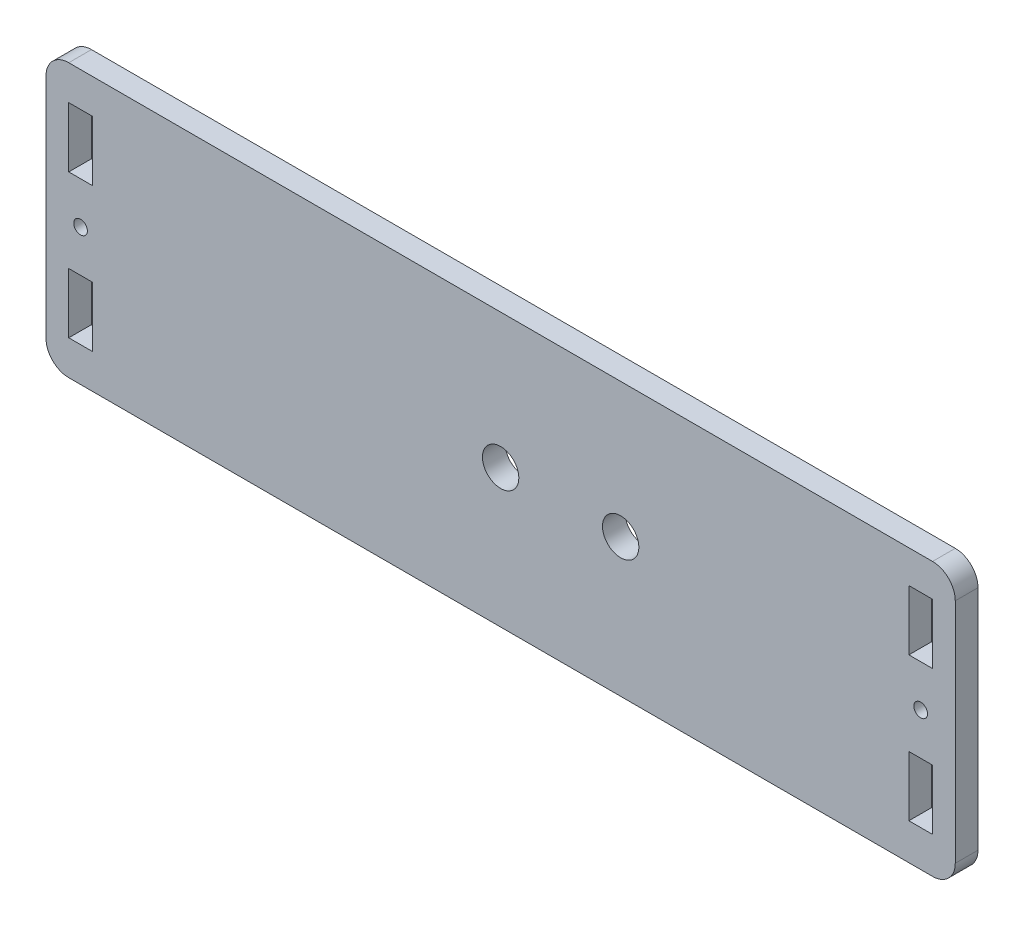
ISO-10303-21;
HEADER;
FILE_DESCRIPTION(('STEP AP214'),'2;1');
FILE_NAME('part.step','',(''),(''),'','','');
FILE_SCHEMA(('AUTOMOTIVE_DESIGN { 1 0 10303 214 1 1 1 1 }'));
ENDSEC;
DATA;
#1=APPLICATION_CONTEXT('core data for automotive mechanical design processes');
#2=APPLICATION_PROTOCOL_DEFINITION('international standard','automotive_design',2000,#1);
#3=PRODUCT_CONTEXT('',#1,'mechanical');
#4=PRODUCT('Part','Part','',(#3));
#5=PRODUCT_RELATED_PRODUCT_CATEGORY('part','',(#4));
#6=PRODUCT_DEFINITION_FORMATION('','',#4);
#7=PRODUCT_DEFINITION_CONTEXT('part definition',#1,'design');
#8=PRODUCT_DEFINITION('design','',#6,#7);
#9=PRODUCT_DEFINITION_SHAPE('','',#8);
#10=(LENGTH_UNIT() NAMED_UNIT(*) SI_UNIT(.MILLI.,.METRE.));
#11=(NAMED_UNIT(*) PLANE_ANGLE_UNIT() SI_UNIT($,.RADIAN.));
#12=(NAMED_UNIT(*) SI_UNIT($,.STERADIAN.) SOLID_ANGLE_UNIT());
#13=UNCERTAINTY_MEASURE_WITH_UNIT(LENGTH_MEASURE(1.E-05),#10,'distance_accuracy_value','');
#14=(GEOMETRIC_REPRESENTATION_CONTEXT(3) GLOBAL_UNCERTAINTY_ASSIGNED_CONTEXT((#13)) GLOBAL_UNIT_ASSIGNED_CONTEXT((#10,
#11,#12)) REPRESENTATION_CONTEXT('',''));
#15=CARTESIAN_POINT('',(0.,0.,0.));
#16=DIRECTION('',(0.,0.,1.));
#17=DIRECTION('',(1.,0.,0.));
#18=AXIS2_PLACEMENT_3D('',#15,#16,#17);
#19=CARTESIAN_POINT('',(50.6270091003654,134.350971349249,5.));
#20=DIRECTION('',(0.,0.,-1.));
#21=DIRECTION('',(-1.,0.,0.));
#22=AXIS2_PLACEMENT_3D('',#19,#20,#21);
#23=PLANE('',#22);
#24=CARTESIAN_POINT('',(-44.3729908996346,109.750971349249,5.));
#25=DIRECTION('',(0.,0.,1.));
#26=DIRECTION('',(1.,0.,0.));
#27=AXIS2_PLACEMENT_3D('',#24,#25,#26);
#28=CIRCLE('',#27,4.00000000000001);
#29=CARTESIAN_POINT('',(-40.3729908996346,109.750971349249,5.));
#30=VERTEX_POINT('',#29);
#31=EDGE_CURVE('E222',#30,#30,#28,.T.);
#32=ORIENTED_EDGE('',*,*,#31,.F.);
#33=EDGE_LOOP('',(#32));
#34=FACE_BOUND('',#33,.T.);
#35=CARTESIAN_POINT('',(-136.770024928728,109.350971349249,5.));
#36=DIRECTION('',(0.,0.,1.));
#37=DIRECTION('',(-1.,0.,0.));
#38=AXIS2_PLACEMENT_3D('',#35,#36,#37);
#39=CIRCLE('',#38,1.5);
#40=CARTESIAN_POINT('',(-138.270024928728,109.350971349249,5.));
#41=VERTEX_POINT('',#40);
#42=EDGE_CURVE('E232',#41,#41,#39,.T.);
#43=ORIENTED_EDGE('',*,*,#42,.F.);
#44=EDGE_LOOP('',(#43));
#45=FACE_BOUND('',#44,.T.);
#46=DIRECTION('',(0.,1.,0.));
#47=VECTOR('',#46,1.);
#48=CARTESIAN_POINT('',(50.624043129459,100.550971349249,5.));
#49=LINE('',#48,#47);
#50=CARTESIAN_POINT('',(50.6240431294589,87.3509713492493,5.));
#51=VERTEX_POINT('',#50);
#52=CARTESIAN_POINT('',(50.624043129459,100.550971349249,5.));
#53=VERTEX_POINT('',#52);
#54=EDGE_CURVE('E244',#51,#53,#49,.T.);
#55=ORIENTED_EDGE('',*,*,#54,.F.);
#56=DIRECTION('',(1.,0.,0.));
#57=VECTOR('',#56,1.);
#58=CARTESIAN_POINT('',(50.6240431294589,87.3509713492493,5.));
#59=LINE('',#58,#57);
#60=CARTESIAN_POINT('',(45.4240431294593,87.3509713492493,5.));
#61=VERTEX_POINT('',#60);
#62=EDGE_CURVE('E252',#61,#51,#59,.T.);
#63=ORIENTED_EDGE('',*,*,#62,.F.);
#64=DIRECTION('',(0.,-1.,0.));
#65=VECTOR('',#64,1.);
#66=CARTESIAN_POINT('',(45.4240431294593,87.3509713492493,5.));
#67=LINE('',#66,#65);
#68=CARTESIAN_POINT('',(45.4240431294593,100.550971349249,5.));
#69=VERTEX_POINT('',#68);
#70=EDGE_CURVE('E249',#69,#61,#67,.T.);
#71=ORIENTED_EDGE('',*,*,#70,.F.);
#72=DIRECTION('',(-1.,0.,0.));
#73=VECTOR('',#72,1.);
#74=CARTESIAN_POINT('',(50.624043129459,100.550971349249,5.));
#75=LINE('',#74,#73);
#76=EDGE_CURVE('E246',#53,#69,#75,.T.);
#77=ORIENTED_EDGE('',*,*,#76,.F.);
#78=EDGE_LOOP('',(#55,#63,#71,#77));
#79=FACE_BOUND('',#78,.T.);
#80=DIRECTION('',(-1.,0.,0.));
#81=VECTOR('',#80,1.);
#82=CARTESIAN_POINT('',(-139.370024928728,131.750971349249,5.));
#83=LINE('',#82,#81);
#84=CARTESIAN_POINT('',(-134.170024928728,131.750971349249,5.));
#85=VERTEX_POINT('',#84);
#86=CARTESIAN_POINT('',(-139.370024928728,131.750971349249,5.));
#87=VERTEX_POINT('',#86);
#88=EDGE_CURVE('E306',#85,#87,#83,.T.);
#89=ORIENTED_EDGE('',*,*,#88,.F.);
#90=DIRECTION('',(0.,1.,0.));
#91=VECTOR('',#90,1.);
#92=CARTESIAN_POINT('',(-134.170024928728,118.550971349249,5.));
#93=LINE('',#92,#91);
#94=CARTESIAN_POINT('',(-134.170024928728,118.550971349249,5.));
#95=VERTEX_POINT('',#94);
#96=EDGE_CURVE('E314',#95,#85,#93,.T.);
#97=ORIENTED_EDGE('',*,*,#96,.F.);
#98=DIRECTION('',(1.,0.,0.));
#99=VECTOR('',#98,1.);
#100=CARTESIAN_POINT('',(-139.370024928728,118.550971349249,5.));
#101=LINE('',#100,#99);
#102=CARTESIAN_POINT('',(-139.370024928728,118.550971349249,5.));
#103=VERTEX_POINT('',#102);
#104=EDGE_CURVE('E311',#103,#95,#101,.T.);
#105=ORIENTED_EDGE('',*,*,#104,.F.);
#106=DIRECTION('',(0.,-1.,0.));
#107=VECTOR('',#106,1.);
#108=CARTESIAN_POINT('',(-139.370024928728,131.750971349249,5.));
#109=LINE('',#108,#107);
#110=EDGE_CURVE('E308',#87,#103,#109,.T.);
#111=ORIENTED_EDGE('',*,*,#110,.F.);
#112=EDGE_LOOP('',(#89,#97,#105,#111));
#113=FACE_BOUND('',#112,.T.);
#114=CARTESIAN_POINT('',(50.6270091003654,134.350971349249,5.));
#115=DIRECTION('',(0.,0.,1.));
#116=DIRECTION('',(-1.,0.,0.));
#117=AXIS2_PLACEMENT_3D('',#114,#115,#116);
#118=CIRCLE('',#117,5.);
#119=CARTESIAN_POINT('',(55.6270091003654,134.350971349249,5.));
#120=VERTEX_POINT('',#119);
#121=CARTESIAN_POINT('',(50.6270091003653,139.350971349249,5.));
#122=VERTEX_POINT('',#121);
#123=EDGE_CURVE('E337',#120,#122,#118,.T.);
#124=ORIENTED_EDGE('',*,*,#123,.T.);
#125=DIRECTION('',(-1.,0.,0.));
#126=VECTOR('',#125,1.);
#127=CARTESIAN_POINT('',(-139.372990899635,139.350971349249,5.));
#128=LINE('',#127,#126);
#129=CARTESIAN_POINT('',(-139.372990899635,139.350971349249,5.));
#130=VERTEX_POINT('',#129);
#131=EDGE_CURVE('E340',#122,#130,#128,.T.);
#132=ORIENTED_EDGE('',*,*,#131,.T.);
#133=CARTESIAN_POINT('',(-139.372990899635,134.350971349249,5.));
#134=DIRECTION('',(0.,0.,1.));
#135=DIRECTION('',(1.,0.,0.));
#136=AXIS2_PLACEMENT_3D('',#133,#134,#135);
#137=CIRCLE('',#136,5.);
#138=CARTESIAN_POINT('',(-144.372990899635,134.350971349249,5.));
#139=VERTEX_POINT('',#138);
#140=EDGE_CURVE('E343',#130,#139,#137,.T.);
#141=ORIENTED_EDGE('',*,*,#140,.T.);
#142=DIRECTION('',(0.,-1.,0.));
#143=VECTOR('',#142,1.);
#144=CARTESIAN_POINT('',(-144.372990899635,134.350971349249,5.));
#145=LINE('',#144,#143);
#146=CARTESIAN_POINT('',(-144.372990899635,84.3509713492494,5.));
#147=VERTEX_POINT('',#146);
#148=EDGE_CURVE('E345',#139,#147,#145,.T.);
#149=ORIENTED_EDGE('',*,*,#148,.T.);
#150=CARTESIAN_POINT('',(-139.372990899635,84.3509713492493,5.));
#151=DIRECTION('',(0.,0.,1.));
#152=DIRECTION('',(1.,0.,0.));
#153=AXIS2_PLACEMENT_3D('',#150,#151,#152);
#154=CIRCLE('',#153,5.);
#155=CARTESIAN_POINT('',(-139.372990899635,79.3509713492493,5.));
#156=VERTEX_POINT('',#155);
#157=EDGE_CURVE('E347',#147,#156,#154,.T.);
#158=ORIENTED_EDGE('',*,*,#157,.T.);
#159=DIRECTION('',(1.,0.,0.));
#160=VECTOR('',#159,1.);
#161=CARTESIAN_POINT('',(-139.372990899635,79.3509713492493,5.));
#162=LINE('',#161,#160);
#163=CARTESIAN_POINT('',(50.6270091003653,79.3509713492493,5.));
#164=VERTEX_POINT('',#163);
#165=EDGE_CURVE('E349',#156,#164,#162,.T.);
#166=ORIENTED_EDGE('',*,*,#165,.T.);
#167=CARTESIAN_POINT('',(50.6270091003654,84.3509713492493,5.));
#168=DIRECTION('',(0.,0.,1.));
#169=DIRECTION('',(1.,0.,0.));
#170=AXIS2_PLACEMENT_3D('',#167,#168,#169);
#171=CIRCLE('',#170,5.);
#172=CARTESIAN_POINT('',(55.6270091003654,84.3509713492494,5.));
#173=VERTEX_POINT('',#172);
#174=EDGE_CURVE('E351',#164,#173,#171,.T.);
#175=ORIENTED_EDGE('',*,*,#174,.T.);
#176=DIRECTION('',(0.,1.,0.));
#177=VECTOR('',#176,1.);
#178=CARTESIAN_POINT('',(55.6270091003654,134.350971349249,5.));
#179=LINE('',#178,#177);
#180=EDGE_CURVE('E353',#173,#120,#179,.T.);
#181=ORIENTED_EDGE('',*,*,#180,.T.);
#182=EDGE_LOOP('',(#124,#132,#141,#149,#158,#166,#175,#181));
#183=FACE_BOUND('',#182,.T.);
#184=DIRECTION('',(-1.,0.,0.));
#185=VECTOR('',#184,1.);
#186=CARTESIAN_POINT('',(50.6240431294592,132.150971349249,5.));
#187=LINE('',#186,#185);
#188=CARTESIAN_POINT('',(50.6240431294592,132.150971349249,5.));
#189=VERTEX_POINT('',#188);
#190=CARTESIAN_POINT('',(45.424043129459,132.150971349249,5.));
#191=VERTEX_POINT('',#190);
#192=EDGE_CURVE('E275',#189,#191,#187,.T.);
#193=ORIENTED_EDGE('',*,*,#192,.F.);
#194=DIRECTION('',(0.,1.,0.));
#195=VECTOR('',#194,1.);
#196=CARTESIAN_POINT('',(50.6240431294592,132.150971349249,5.));
#197=LINE('',#196,#195);
#198=CARTESIAN_POINT('',(50.6240431294592,118.950971349249,5.));
#199=VERTEX_POINT('',#198);
#200=EDGE_CURVE('E283',#199,#189,#197,.T.);
#201=ORIENTED_EDGE('',*,*,#200,.F.);
#202=DIRECTION('',(1.,0.,0.));
#203=VECTOR('',#202,1.);
#204=CARTESIAN_POINT('',(50.6240431294592,118.950971349249,5.));
#205=LINE('',#204,#203);
#206=CARTESIAN_POINT('',(45.424043129459,118.950971349249,5.));
#207=VERTEX_POINT('',#206);
#208=EDGE_CURVE('E280',#207,#199,#205,.T.);
#209=ORIENTED_EDGE('',*,*,#208,.F.);
#210=DIRECTION('',(0.,-1.,0.));
#211=VECTOR('',#210,1.);
#212=CARTESIAN_POINT('',(45.424043129459,118.950971349249,5.));
#213=LINE('',#212,#211);
#214=EDGE_CURVE('E277',#191,#207,#213,.T.);
#215=ORIENTED_EDGE('',*,*,#214,.F.);
#216=EDGE_LOOP('',(#193,#201,#209,#215));
#217=FACE_BOUND('',#216,.T.);
#218=CARTESIAN_POINT('',(48.0240431294591,109.750971349249,5.));
#219=DIRECTION('',(0.,0.,1.));
#220=DIRECTION('',(1.,0.,0.));
#221=AXIS2_PLACEMENT_3D('',#218,#219,#220);
#222=CIRCLE('',#221,1.5);
#223=CARTESIAN_POINT('',(49.5240431294591,109.750971349249,5.));
#224=VERTEX_POINT('',#223);
#225=EDGE_CURVE('E238',#224,#224,#222,.T.);
#226=ORIENTED_EDGE('',*,*,#225,.F.);
#227=EDGE_LOOP('',(#226));
#228=FACE_BOUND('',#227,.T.);
#229=DIRECTION('',(-1.,0.,0.));
#230=VECTOR('',#229,1.);
#231=CARTESIAN_POINT('',(-139.370024928729,100.150971349249,5.));
#232=LINE('',#231,#230);
#233=CARTESIAN_POINT('',(-134.17002492873,100.150971349249,5.));
#234=VERTEX_POINT('',#233);
#235=CARTESIAN_POINT('',(-139.370024928729,100.150971349249,5.));
#236=VERTEX_POINT('',#235);
#237=EDGE_CURVE('E193',#234,#236,#232,.T.);
#238=ORIENTED_EDGE('',*,*,#237,.F.);
#239=DIRECTION('',(0.,1.,0.));
#240=VECTOR('',#239,1.);
#241=CARTESIAN_POINT('',(-134.17002492873,86.9509713492492,5.));
#242=LINE('',#241,#240);
#243=CARTESIAN_POINT('',(-134.17002492873,86.9509713492492,5.));
#244=VERTEX_POINT('',#243);
#245=EDGE_CURVE('E216',#244,#234,#242,.T.);
#246=ORIENTED_EDGE('',*,*,#245,.F.);
#247=DIRECTION('',(1.,0.,0.));
#248=VECTOR('',#247,1.);
#249=CARTESIAN_POINT('',(-139.370024928729,86.9509713492492,5.));
#250=LINE('',#249,#248);
#251=CARTESIAN_POINT('',(-139.370024928729,86.9509713492492,5.));
#252=VERTEX_POINT('',#251);
#253=EDGE_CURVE('E214',#252,#244,#250,.T.);
#254=ORIENTED_EDGE('',*,*,#253,.F.);
#255=DIRECTION('',(0.,-1.,0.));
#256=VECTOR('',#255,1.);
#257=CARTESIAN_POINT('',(-139.370024928729,100.150971349249,5.));
#258=LINE('',#257,#256);
#259=EDGE_CURVE('E201',#236,#252,#258,.T.);
#260=ORIENTED_EDGE('',*,*,#259,.F.);
#261=EDGE_LOOP('',(#238,#246,#254,#260));
#262=FACE_BOUND('',#261,.T.);
#263=CARTESIAN_POINT('',(-17.9729908996346,109.750971349249,5.));
#264=DIRECTION('',(0.,0.,1.));
#265=DIRECTION('',(1.,0.,0.));
#266=AXIS2_PLACEMENT_3D('',#263,#264,#265);
#267=CIRCLE('',#266,4.00000000000001);
#268=CARTESIAN_POINT('',(-13.9729908996346,109.750971349249,5.));
#269=VERTEX_POINT('',#268);
#270=EDGE_CURVE('E547',#269,#269,#267,.T.);
#271=ORIENTED_EDGE('',*,*,#270,.F.);
#272=EDGE_LOOP('',(#271));
#273=FACE_BOUND('',#272,.T.);
#274=ADVANCED_FACE('F32',(#34,#45,#79,#113,#183,#217,#228,#262,#273),#23,.F.);
#275=CARTESIAN_POINT('',(50.6270091003654,134.350971349249,0.));
#276=DIRECTION('',(0.,0.,-1.));
#277=DIRECTION('',(-1.,0.,0.));
#278=AXIS2_PLACEMENT_3D('',#275,#276,#277);
#279=PLANE('',#278);
#280=CARTESIAN_POINT('',(-44.3729908996346,109.750971349249,0.));
#281=DIRECTION('',(0.,0.,1.));
#282=DIRECTION('',(1.,0.,0.));
#283=AXIS2_PLACEMENT_3D('',#280,#281,#282);
#284=CIRCLE('',#283,4.00000000000001);
#285=CARTESIAN_POINT('',(-40.3729908996346,109.750971349249,0.));
#286=VERTEX_POINT('',#285);
#287=EDGE_CURVE('E553',#286,#286,#284,.T.);
#288=ORIENTED_EDGE('',*,*,#287,.T.);
#289=EDGE_LOOP('',(#288));
#290=FACE_BOUND('',#289,.T.);
#291=CARTESIAN_POINT('',(-136.770024928728,109.350971349249,0.));
#292=DIRECTION('',(0.,0.,1.));
#293=DIRECTION('',(-1.,0.,0.));
#294=AXIS2_PLACEMENT_3D('',#291,#292,#293);
#295=CIRCLE('',#294,1.5);
#296=CARTESIAN_POINT('',(-138.270024928728,109.350971349249,0.));
#297=VERTEX_POINT('',#296);
#298=EDGE_CURVE('E209',#297,#297,#295,.T.);
#299=ORIENTED_EDGE('',*,*,#298,.T.);
#300=EDGE_LOOP('',(#299));
#301=FACE_BOUND('',#300,.T.);
#302=DIRECTION('',(1.,0.,0.));
#303=VECTOR('',#302,1.);
#304=CARTESIAN_POINT('',(50.6240431294589,87.3509713492493,0.));
#305=LINE('',#304,#303);
#306=CARTESIAN_POINT('',(45.4240431294593,87.3509713492493,0.));
#307=VERTEX_POINT('',#306);
#308=CARTESIAN_POINT('',(50.6240431294589,87.3509713492493,0.));
#309=VERTEX_POINT('',#308);
#310=EDGE_CURVE('E247',#307,#309,#305,.T.);
#311=ORIENTED_EDGE('',*,*,#310,.T.);
#312=DIRECTION('',(0.,1.,0.));
#313=VECTOR('',#312,1.);
#314=CARTESIAN_POINT('',(50.624043129459,100.550971349249,0.));
#315=LINE('',#314,#313);
#316=CARTESIAN_POINT('',(50.624043129459,100.550971349249,0.));
#317=VERTEX_POINT('',#316);
#318=EDGE_CURVE('E241',#309,#317,#315,.T.);
#319=ORIENTED_EDGE('',*,*,#318,.T.);
#320=DIRECTION('',(-1.,0.,0.));
#321=VECTOR('',#320,1.);
#322=CARTESIAN_POINT('',(50.624043129459,100.550971349249,0.));
#323=LINE('',#322,#321);
#324=CARTESIAN_POINT('',(45.4240431294593,100.550971349249,0.));
#325=VERTEX_POINT('',#324);
#326=EDGE_CURVE('E257',#317,#325,#323,.T.);
#327=ORIENTED_EDGE('',*,*,#326,.T.);
#328=DIRECTION('',(0.,-1.,0.));
#329=VECTOR('',#328,1.);
#330=CARTESIAN_POINT('',(45.4240431294593,87.3509713492493,0.));
#331=LINE('',#330,#329);
#332=EDGE_CURVE('E260',#325,#307,#331,.T.);
#333=ORIENTED_EDGE('',*,*,#332,.T.);
#334=EDGE_LOOP('',(#311,#319,#327,#333));
#335=FACE_BOUND('',#334,.T.);
#336=DIRECTION('',(0.,1.,0.));
#337=VECTOR('',#336,1.);
#338=CARTESIAN_POINT('',(-134.170024928728,118.550971349249,0.));
#339=LINE('',#338,#337);
#340=CARTESIAN_POINT('',(-134.170024928728,118.550971349249,0.));
#341=VERTEX_POINT('',#340);
#342=CARTESIAN_POINT('',(-134.170024928728,131.750971349249,0.));
#343=VERTEX_POINT('',#342);
#344=EDGE_CURVE('E309',#341,#343,#339,.T.);
#345=ORIENTED_EDGE('',*,*,#344,.T.);
#346=DIRECTION('',(-1.,0.,0.));
#347=VECTOR('',#346,1.);
#348=CARTESIAN_POINT('',(-139.370024928728,131.750971349249,0.));
#349=LINE('',#348,#347);
#350=CARTESIAN_POINT('',(-139.370024928728,131.750971349249,0.));
#351=VERTEX_POINT('',#350);
#352=EDGE_CURVE('E305',#343,#351,#349,.T.);
#353=ORIENTED_EDGE('',*,*,#352,.T.);
#354=DIRECTION('',(0.,-1.,0.));
#355=VECTOR('',#354,1.);
#356=CARTESIAN_POINT('',(-139.370024928728,131.750971349249,0.));
#357=LINE('',#356,#355);
#358=CARTESIAN_POINT('',(-139.370024928728,118.550971349249,0.));
#359=VERTEX_POINT('',#358);
#360=EDGE_CURVE('E319',#351,#359,#357,.T.);
#361=ORIENTED_EDGE('',*,*,#360,.T.);
#362=DIRECTION('',(1.,0.,0.));
#363=VECTOR('',#362,1.);
#364=CARTESIAN_POINT('',(-139.370024928728,118.550971349249,0.));
#365=LINE('',#364,#363);
#366=EDGE_CURVE('E322',#359,#341,#365,.T.);
#367=ORIENTED_EDGE('',*,*,#366,.T.);
#368=EDGE_LOOP('',(#345,#353,#361,#367));
#369=FACE_BOUND('',#368,.T.);
#370=CARTESIAN_POINT('',(50.6270091003654,134.350971349249,0.));
#371=DIRECTION('',(0.,0.,1.));
#372=DIRECTION('',(-1.,0.,0.));
#373=AXIS2_PLACEMENT_3D('',#370,#371,#372);
#374=CIRCLE('',#373,5.);
#375=CARTESIAN_POINT('',(55.6270091003654,134.350971349249,0.));
#376=VERTEX_POINT('',#375);
#377=CARTESIAN_POINT('',(50.6270091003653,139.350971349249,0.));
#378=VERTEX_POINT('',#377);
#379=EDGE_CURVE('E336',#376,#378,#374,.T.);
#380=ORIENTED_EDGE('',*,*,#379,.F.);
#381=DIRECTION('',(0.,1.,0.));
#382=VECTOR('',#381,1.);
#383=CARTESIAN_POINT('',(55.6270091003654,134.350971349249,0.));
#384=LINE('',#383,#382);
#385=CARTESIAN_POINT('',(55.6270091003654,84.3509713492494,0.));
#386=VERTEX_POINT('',#385);
#387=EDGE_CURVE('E341',#386,#376,#384,.T.);
#388=ORIENTED_EDGE('',*,*,#387,.F.);
#389=CARTESIAN_POINT('',(50.6270091003654,84.3509713492493,0.));
#390=DIRECTION('',(0.,0.,1.));
#391=DIRECTION('',(1.,0.,0.));
#392=AXIS2_PLACEMENT_3D('',#389,#390,#391);
#393=CIRCLE('',#392,5.);
#394=CARTESIAN_POINT('',(50.6270091003653,79.3509713492493,0.));
#395=VERTEX_POINT('',#394);
#396=EDGE_CURVE('E368',#395,#386,#393,.T.);
#397=ORIENTED_EDGE('',*,*,#396,.F.);
#398=DIRECTION('',(1.,0.,0.));
#399=VECTOR('',#398,1.);
#400=CARTESIAN_POINT('',(-139.372990899635,79.3509713492493,0.));
#401=LINE('',#400,#399);
#402=CARTESIAN_POINT('',(-139.372990899635,79.3509713492493,0.));
#403=VERTEX_POINT('',#402);
#404=EDGE_CURVE('E366',#403,#395,#401,.T.);
#405=ORIENTED_EDGE('',*,*,#404,.F.);
#406=CARTESIAN_POINT('',(-139.372990899635,84.3509713492493,0.));
#407=DIRECTION('',(0.,0.,1.));
#408=DIRECTION('',(1.,0.,0.));
#409=AXIS2_PLACEMENT_3D('',#406,#407,#408);
#410=CIRCLE('',#409,5.);
#411=CARTESIAN_POINT('',(-144.372990899635,84.3509713492494,0.));
#412=VERTEX_POINT('',#411);
#413=EDGE_CURVE('E364',#412,#403,#410,.T.);
#414=ORIENTED_EDGE('',*,*,#413,.F.);
#415=DIRECTION('',(0.,-1.,0.));
#416=VECTOR('',#415,1.);
#417=CARTESIAN_POINT('',(-144.372990899635,134.350971349249,0.));
#418=LINE('',#417,#416);
#419=CARTESIAN_POINT('',(-144.372990899635,134.350971349249,0.));
#420=VERTEX_POINT('',#419);
#421=EDGE_CURVE('E362',#420,#412,#418,.T.);
#422=ORIENTED_EDGE('',*,*,#421,.F.);
#423=CARTESIAN_POINT('',(-139.372990899635,134.350971349249,0.));
#424=DIRECTION('',(0.,0.,1.));
#425=DIRECTION('',(1.,0.,0.));
#426=AXIS2_PLACEMENT_3D('',#423,#424,#425);
#427=CIRCLE('',#426,5.);
#428=CARTESIAN_POINT('',(-139.372990899635,139.350971349249,0.));
#429=VERTEX_POINT('',#428);
#430=EDGE_CURVE('E360',#429,#420,#427,.T.);
#431=ORIENTED_EDGE('',*,*,#430,.F.);
#432=DIRECTION('',(-1.,0.,0.));
#433=VECTOR('',#432,1.);
#434=CARTESIAN_POINT('',(-139.372990899635,139.350971349249,0.));
#435=LINE('',#434,#433);
#436=EDGE_CURVE('E358',#378,#429,#435,.T.);
#437=ORIENTED_EDGE('',*,*,#436,.F.);
#438=EDGE_LOOP('',(#380,#388,#397,#405,#414,#422,#431,#437));
#439=FACE_BOUND('',#438,.T.);
#440=DIRECTION('',(0.,1.,0.));
#441=VECTOR('',#440,1.);
#442=CARTESIAN_POINT('',(50.6240431294592,132.150971349249,0.));
#443=LINE('',#442,#441);
#444=CARTESIAN_POINT('',(50.6240431294592,118.950971349249,0.));
#445=VERTEX_POINT('',#444);
#446=CARTESIAN_POINT('',(50.6240431294592,132.150971349249,0.));
#447=VERTEX_POINT('',#446);
#448=EDGE_CURVE('E278',#445,#447,#443,.T.);
#449=ORIENTED_EDGE('',*,*,#448,.T.);
#450=DIRECTION('',(-1.,0.,0.));
#451=VECTOR('',#450,1.);
#452=CARTESIAN_POINT('',(50.6240431294592,132.150971349249,0.));
#453=LINE('',#452,#451);
#454=CARTESIAN_POINT('',(45.424043129459,132.150971349249,0.));
#455=VERTEX_POINT('',#454);
#456=EDGE_CURVE('E274',#447,#455,#453,.T.);
#457=ORIENTED_EDGE('',*,*,#456,.T.);
#458=DIRECTION('',(0.,-1.,0.));
#459=VECTOR('',#458,1.);
#460=CARTESIAN_POINT('',(45.424043129459,118.950971349249,0.));
#461=LINE('',#460,#459);
#462=CARTESIAN_POINT('',(45.424043129459,118.950971349249,0.));
#463=VERTEX_POINT('',#462);
#464=EDGE_CURVE('E288',#455,#463,#461,.T.);
#465=ORIENTED_EDGE('',*,*,#464,.T.);
#466=DIRECTION('',(1.,0.,0.));
#467=VECTOR('',#466,1.);
#468=CARTESIAN_POINT('',(50.6240431294592,118.950971349249,0.));
#469=LINE('',#468,#467);
#470=EDGE_CURVE('E291',#463,#445,#469,.T.);
#471=ORIENTED_EDGE('',*,*,#470,.T.);
#472=EDGE_LOOP('',(#449,#457,#465,#471));
#473=FACE_BOUND('',#472,.T.);
#474=CARTESIAN_POINT('',(48.0240431294591,109.750971349249,0.));
#475=DIRECTION('',(0.,0.,1.));
#476=DIRECTION('',(1.,0.,0.));
#477=AXIS2_PLACEMENT_3D('',#474,#475,#476);
#478=CIRCLE('',#477,1.5);
#479=CARTESIAN_POINT('',(49.5240431294591,109.750971349249,0.));
#480=VERTEX_POINT('',#479);
#481=EDGE_CURVE('E235',#480,#480,#478,.T.);
#482=ORIENTED_EDGE('',*,*,#481,.T.);
#483=EDGE_LOOP('',(#482));
#484=FACE_BOUND('',#483,.T.);
#485=DIRECTION('',(0.,1.,0.));
#486=VECTOR('',#485,1.);
#487=CARTESIAN_POINT('',(-134.17002492873,86.9509713492492,0.));
#488=LINE('',#487,#486);
#489=CARTESIAN_POINT('',(-134.17002492873,86.9509713492492,0.));
#490=VERTEX_POINT('',#489);
#491=CARTESIAN_POINT('',(-134.17002492873,100.150971349249,0.));
#492=VERTEX_POINT('',#491);
#493=EDGE_CURVE('E202',#490,#492,#488,.T.);
#494=ORIENTED_EDGE('',*,*,#493,.T.);
#495=DIRECTION('',(-1.,0.,0.));
#496=VECTOR('',#495,1.);
#497=CARTESIAN_POINT('',(-139.370024928729,100.150971349249,0.));
#498=LINE('',#497,#496);
#499=CARTESIAN_POINT('',(-139.370024928729,100.150971349249,0.));
#500=VERTEX_POINT('',#499);
#501=EDGE_CURVE('E55',#492,#500,#498,.T.);
#502=ORIENTED_EDGE('',*,*,#501,.T.);
#503=DIRECTION('',(0.,-1.,0.));
#504=VECTOR('',#503,1.);
#505=CARTESIAN_POINT('',(-139.370024928729,100.150971349249,0.));
#506=LINE('',#505,#504);
#507=CARTESIAN_POINT('',(-139.370024928729,86.9509713492492,0.));
#508=VERTEX_POINT('',#507);
#509=EDGE_CURVE('E208',#500,#508,#506,.T.);
#510=ORIENTED_EDGE('',*,*,#509,.T.);
#511=DIRECTION('',(1.,0.,0.));
#512=VECTOR('',#511,1.);
#513=CARTESIAN_POINT('',(-139.370024928729,86.9509713492492,0.));
#514=LINE('',#513,#512);
#515=EDGE_CURVE('E224',#508,#490,#514,.T.);
#516=ORIENTED_EDGE('',*,*,#515,.T.);
#517=EDGE_LOOP('',(#494,#502,#510,#516));
#518=FACE_BOUND('',#517,.T.);
#519=CARTESIAN_POINT('',(-17.9729908996346,109.750971349249,0.));
#520=DIRECTION('',(0.,0.,1.));
#521=DIRECTION('',(1.,0.,0.));
#522=AXIS2_PLACEMENT_3D('',#519,#520,#521);
#523=CIRCLE('',#522,4.00000000000001);
#524=CARTESIAN_POINT('',(-13.9729908996346,109.750971349249,0.));
#525=VERTEX_POINT('',#524);
#526=EDGE_CURVE('E550',#525,#525,#523,.T.);
#527=ORIENTED_EDGE('',*,*,#526,.T.);
#528=EDGE_LOOP('',(#527));
#529=FACE_BOUND('',#528,.T.);
#530=ADVANCED_FACE('F398',(#290,#301,#335,#369,#439,#473,#484,#518,#529),#279,.T.);
#531=CARTESIAN_POINT('',(50.6270091003654,134.350971349249,5.));
#532=DIRECTION('',(0.,0.,-1.));
#533=DIRECTION('',(-1.,0.,0.));
#534=AXIS2_PLACEMENT_3D('',#531,#532,#533);
#535=CYLINDRICAL_SURFACE('',#534,5.);
#536=ORIENTED_EDGE('',*,*,#379,.T.);
#537=DIRECTION('',(0.,0.,-1.));
#538=VECTOR('',#537,1.);
#539=CARTESIAN_POINT('',(50.6270091003653,139.350971349249,5.));
#540=LINE('',#539,#538);
#541=EDGE_CURVE('E11',#122,#378,#540,.T.);
#542=ORIENTED_EDGE('',*,*,#541,.F.);
#543=ORIENTED_EDGE('',*,*,#123,.F.);
#544=DIRECTION('',(0.,0.,-1.));
#545=VECTOR('',#544,1.);
#546=CARTESIAN_POINT('',(55.6270091003654,134.350971349249,5.));
#547=LINE('',#546,#545);
#548=EDGE_CURVE('E355',#120,#376,#547,.T.);
#549=ORIENTED_EDGE('',*,*,#548,.T.);
#550=EDGE_LOOP('',(#536,#542,#543,#549));
#551=FACE_BOUND('',#550,.T.);
#552=ADVANCED_FACE('F34',(#551),#535,.T.);
#553=CARTESIAN_POINT('',(-139.372990899635,139.350971349249,5.));
#554=DIRECTION('',(0.,-1.,0.));
#555=DIRECTION('',(1.,0.,0.));
#556=AXIS2_PLACEMENT_3D('',#553,#554,#555);
#557=PLANE('',#556);
#558=ORIENTED_EDGE('',*,*,#436,.T.);
#559=DIRECTION('',(0.,0.,-1.));
#560=VECTOR('',#559,1.);
#561=CARTESIAN_POINT('',(-139.372990899635,139.350971349249,5.));
#562=LINE('',#561,#560);
#563=EDGE_CURVE('E40',#130,#429,#562,.T.);
#564=ORIENTED_EDGE('',*,*,#563,.F.);
#565=ORIENTED_EDGE('',*,*,#131,.F.);
#566=ORIENTED_EDGE('',*,*,#541,.T.);
#567=EDGE_LOOP('',(#558,#564,#565,#566));
#568=FACE_BOUND('',#567,.T.);
#569=ADVANCED_FACE('F416',(#568),#557,.F.);
#570=CARTESIAN_POINT('',(-139.372990899635,134.350971349249,5.));
#571=DIRECTION('',(0.,0.,-1.));
#572=DIRECTION('',(-1.,0.,0.));
#573=AXIS2_PLACEMENT_3D('',#570,#571,#572);
#574=CYLINDRICAL_SURFACE('',#573,5.);
#575=ORIENTED_EDGE('',*,*,#430,.T.);
#576=DIRECTION('',(0.,0.,-1.));
#577=VECTOR('',#576,1.);
#578=CARTESIAN_POINT('',(-144.372990899635,134.350971349249,5.));
#579=LINE('',#578,#577);
#580=EDGE_CURVE('E385',#139,#420,#579,.T.);
#581=ORIENTED_EDGE('',*,*,#580,.F.);
#582=ORIENTED_EDGE('',*,*,#140,.F.);
#583=ORIENTED_EDGE('',*,*,#563,.T.);
#584=EDGE_LOOP('',(#575,#581,#582,#583));
#585=FACE_BOUND('',#584,.T.);
#586=ADVANCED_FACE('F392',(#585),#574,.T.);
#587=CARTESIAN_POINT('',(-144.372990899635,134.350971349249,5.));
#588=DIRECTION('',(1.,0.,0.));
#589=DIRECTION('',(0.,0.,-1.));
#590=AXIS2_PLACEMENT_3D('',#587,#588,#589);
#591=PLANE('',#590);
#592=ORIENTED_EDGE('',*,*,#421,.T.);
#593=DIRECTION('',(0.,0.,-1.));
#594=VECTOR('',#593,1.);
#595=CARTESIAN_POINT('',(-144.372990899635,84.3509713492494,5.));
#596=LINE('',#595,#594);
#597=EDGE_CURVE('E382',#147,#412,#596,.T.);
#598=ORIENTED_EDGE('',*,*,#597,.F.);
#599=ORIENTED_EDGE('',*,*,#148,.F.);
#600=ORIENTED_EDGE('',*,*,#580,.T.);
#601=EDGE_LOOP('',(#592,#598,#599,#600));
#602=FACE_BOUND('',#601,.T.);
#603=ADVANCED_FACE('F404',(#602),#591,.F.);
#604=CARTESIAN_POINT('',(-139.372990899635,84.3509713492493,5.));
#605=DIRECTION('',(0.,0.,-1.));
#606=DIRECTION('',(-1.,0.,0.));
#607=AXIS2_PLACEMENT_3D('',#604,#605,#606);
#608=CYLINDRICAL_SURFACE('',#607,5.);
#609=ORIENTED_EDGE('',*,*,#413,.T.);
#610=DIRECTION('',(0.,0.,-1.));
#611=VECTOR('',#610,1.);
#612=CARTESIAN_POINT('',(-139.372990899635,79.3509713492493,5.));
#613=LINE('',#612,#611);
#614=EDGE_CURVE('E379',#156,#403,#613,.T.);
#615=ORIENTED_EDGE('',*,*,#614,.F.);
#616=ORIENTED_EDGE('',*,*,#157,.F.);
#617=ORIENTED_EDGE('',*,*,#597,.T.);
#618=EDGE_LOOP('',(#609,#615,#616,#617));
#619=FACE_BOUND('',#618,.T.);
#620=ADVANCED_FACE('F408',(#619),#608,.T.);
#621=CARTESIAN_POINT('',(-139.372990899635,79.3509713492493,5.));
#622=DIRECTION('',(0.,1.,0.));
#623=DIRECTION('',(0.,0.,1.));
#624=AXIS2_PLACEMENT_3D('',#621,#622,#623);
#625=PLANE('',#624);
#626=ORIENTED_EDGE('',*,*,#404,.T.);
#627=DIRECTION('',(0.,0.,-1.));
#628=VECTOR('',#627,1.);
#629=CARTESIAN_POINT('',(50.6270091003653,79.3509713492493,5.));
#630=LINE('',#629,#628);
#631=EDGE_CURVE('E376',#164,#395,#630,.T.);
#632=ORIENTED_EDGE('',*,*,#631,.F.);
#633=ORIENTED_EDGE('',*,*,#165,.F.);
#634=ORIENTED_EDGE('',*,*,#614,.T.);
#635=EDGE_LOOP('',(#626,#632,#633,#634));
#636=FACE_BOUND('',#635,.T.);
#637=ADVANCED_FACE('F429',(#636),#625,.F.);
#638=CARTESIAN_POINT('',(50.6270091003654,84.3509713492493,5.));
#639=DIRECTION('',(0.,0.,-1.));
#640=DIRECTION('',(-1.,0.,0.));
#641=AXIS2_PLACEMENT_3D('',#638,#639,#640);
#642=CYLINDRICAL_SURFACE('',#641,5.);
#643=ORIENTED_EDGE('',*,*,#396,.T.);
#644=DIRECTION('',(0.,0.,-1.));
#645=VECTOR('',#644,1.);
#646=CARTESIAN_POINT('',(55.6270091003654,84.3509713492494,5.));
#647=LINE('',#646,#645);
#648=EDGE_CURVE('E373',#173,#386,#647,.T.);
#649=ORIENTED_EDGE('',*,*,#648,.F.);
#650=ORIENTED_EDGE('',*,*,#174,.F.);
#651=ORIENTED_EDGE('',*,*,#631,.T.);
#652=EDGE_LOOP('',(#643,#649,#650,#651));
#653=FACE_BOUND('',#652,.T.);
#654=ADVANCED_FACE('F427',(#653),#642,.T.);
#655=CARTESIAN_POINT('',(55.6270091003654,134.350971349249,5.));
#656=DIRECTION('',(-1.,0.,0.));
#657=DIRECTION('',(0.,0.,1.));
#658=AXIS2_PLACEMENT_3D('',#655,#656,#657);
#659=PLANE('',#658);
#660=ORIENTED_EDGE('',*,*,#387,.T.);
#661=ORIENTED_EDGE('',*,*,#548,.F.);
#662=ORIENTED_EDGE('',*,*,#180,.F.);
#663=ORIENTED_EDGE('',*,*,#648,.T.);
#664=EDGE_LOOP('',(#660,#661,#662,#663));
#665=FACE_BOUND('',#664,.T.);
#666=ADVANCED_FACE('F422',(#665),#659,.F.);
#667=CARTESIAN_POINT('',(-139.370024928728,131.750971349249,5.));
#668=DIRECTION('',(0.,-1.,0.));
#669=DIRECTION('',(0.,0.,-1.));
#670=AXIS2_PLACEMENT_3D('',#667,#668,#669);
#671=PLANE('',#670);
#672=ORIENTED_EDGE('',*,*,#352,.F.);
#673=DIRECTION('',(0.,0.,-1.));
#674=VECTOR('',#673,1.);
#675=CARTESIAN_POINT('',(-134.170024928728,131.750971349249,5.));
#676=LINE('',#675,#674);
#677=EDGE_CURVE('E316',#85,#343,#676,.T.);
#678=ORIENTED_EDGE('',*,*,#677,.F.);
#679=ORIENTED_EDGE('',*,*,#88,.T.);
#680=DIRECTION('',(0.,0.,-1.));
#681=VECTOR('',#680,1.);
#682=CARTESIAN_POINT('',(-139.370024928728,131.750971349249,5.));
#683=LINE('',#682,#681);
#684=EDGE_CURVE('E333',#87,#351,#683,.T.);
#685=ORIENTED_EDGE('',*,*,#684,.T.);
#686=EDGE_LOOP('',(#672,#678,#679,#685));
#687=FACE_BOUND('',#686,.T.);
#688=ADVANCED_FACE('F449',(#687),#671,.T.);
#689=CARTESIAN_POINT('',(-139.370024928728,131.750971349249,5.));
#690=DIRECTION('',(1.,0.,0.));
#691=DIRECTION('',(0.,0.,-1.));
#692=AXIS2_PLACEMENT_3D('',#689,#690,#691);
#693=PLANE('',#692);
#694=ORIENTED_EDGE('',*,*,#360,.F.);
#695=ORIENTED_EDGE('',*,*,#684,.F.);
#696=ORIENTED_EDGE('',*,*,#110,.T.);
#697=DIRECTION('',(0.,0.,-1.));
#698=VECTOR('',#697,1.);
#699=CARTESIAN_POINT('',(-139.370024928728,118.550971349249,5.));
#700=LINE('',#699,#698);
#701=EDGE_CURVE('E331',#103,#359,#700,.T.);
#702=ORIENTED_EDGE('',*,*,#701,.T.);
#703=EDGE_LOOP('',(#694,#695,#696,#702));
#704=FACE_BOUND('',#703,.T.);
#705=ADVANCED_FACE('F456',(#704),#693,.T.);
#706=CARTESIAN_POINT('',(-139.370024928728,118.550971349249,5.));
#707=DIRECTION('',(0.,1.,0.));
#708=DIRECTION('',(0.,0.,1.));
#709=AXIS2_PLACEMENT_3D('',#706,#707,#708);
#710=PLANE('',#709);
#711=ORIENTED_EDGE('',*,*,#366,.F.);
#712=ORIENTED_EDGE('',*,*,#701,.F.);
#713=ORIENTED_EDGE('',*,*,#104,.T.);
#714=DIRECTION('',(0.,0.,-1.));
#715=VECTOR('',#714,1.);
#716=CARTESIAN_POINT('',(-134.170024928728,118.550971349249,5.));
#717=LINE('',#716,#715);
#718=EDGE_CURVE('E329',#95,#341,#717,.T.);
#719=ORIENTED_EDGE('',*,*,#718,.T.);
#720=EDGE_LOOP('',(#711,#712,#713,#719));
#721=FACE_BOUND('',#720,.T.);
#722=ADVANCED_FACE('F461',(#721),#710,.T.);
#723=CARTESIAN_POINT('',(-134.170024928728,118.550971349249,5.));
#724=DIRECTION('',(-1.,0.,0.));
#725=DIRECTION('',(0.,0.,1.));
#726=AXIS2_PLACEMENT_3D('',#723,#724,#725);
#727=PLANE('',#726);
#728=ORIENTED_EDGE('',*,*,#344,.F.);
#729=ORIENTED_EDGE('',*,*,#718,.F.);
#730=ORIENTED_EDGE('',*,*,#96,.T.);
#731=ORIENTED_EDGE('',*,*,#677,.T.);
#732=EDGE_LOOP('',(#728,#729,#730,#731));
#733=FACE_BOUND('',#732,.T.);
#734=ADVANCED_FACE('F469',(#733),#727,.T.);
#735=CARTESIAN_POINT('',(50.6240431294592,132.150971349249,5.));
#736=DIRECTION('',(0.,-1.,0.));
#737=DIRECTION('',(0.,0.,-1.));
#738=AXIS2_PLACEMENT_3D('',#735,#736,#737);
#739=PLANE('',#738);
#740=ORIENTED_EDGE('',*,*,#456,.F.);
#741=DIRECTION('',(0.,0.,-1.));
#742=VECTOR('',#741,1.);
#743=CARTESIAN_POINT('',(50.6240431294592,132.150971349249,5.));
#744=LINE('',#743,#742);
#745=EDGE_CURVE('E285',#189,#447,#744,.T.);
#746=ORIENTED_EDGE('',*,*,#745,.F.);
#747=ORIENTED_EDGE('',*,*,#192,.T.);
#748=DIRECTION('',(0.,0.,-1.));
#749=VECTOR('',#748,1.);
#750=CARTESIAN_POINT('',(45.424043129459,132.150971349249,5.));
#751=LINE('',#750,#749);
#752=EDGE_CURVE('E302',#191,#455,#751,.T.);
#753=ORIENTED_EDGE('',*,*,#752,.T.);
#754=EDGE_LOOP('',(#740,#746,#747,#753));
#755=FACE_BOUND('',#754,.T.);
#756=ADVANCED_FACE('F482',(#755),#739,.T.);
#757=CARTESIAN_POINT('',(45.424043129459,118.950971349249,5.));
#758=DIRECTION('',(1.,0.,0.));
#759=DIRECTION('',(0.,1.,0.));
#760=AXIS2_PLACEMENT_3D('',#757,#758,#759);
#761=PLANE('',#760);
#762=ORIENTED_EDGE('',*,*,#464,.F.);
#763=ORIENTED_EDGE('',*,*,#752,.F.);
#764=ORIENTED_EDGE('',*,*,#214,.T.);
#765=DIRECTION('',(0.,0.,-1.));
#766=VECTOR('',#765,1.);
#767=CARTESIAN_POINT('',(45.424043129459,118.950971349249,5.));
#768=LINE('',#767,#766);
#769=EDGE_CURVE('E300',#207,#463,#768,.T.);
#770=ORIENTED_EDGE('',*,*,#769,.T.);
#771=EDGE_LOOP('',(#762,#763,#764,#770));
#772=FACE_BOUND('',#771,.T.);
#773=ADVANCED_FACE('F487',(#772),#761,.T.);
#774=CARTESIAN_POINT('',(50.6240431294592,118.950971349249,5.));
#775=DIRECTION('',(0.,1.,0.));
#776=DIRECTION('',(0.,0.,1.));
#777=AXIS2_PLACEMENT_3D('',#774,#775,#776);
#778=PLANE('',#777);
#779=ORIENTED_EDGE('',*,*,#470,.F.);
#780=ORIENTED_EDGE('',*,*,#769,.F.);
#781=ORIENTED_EDGE('',*,*,#208,.T.);
#782=DIRECTION('',(0.,0.,-1.));
#783=VECTOR('',#782,1.);
#784=CARTESIAN_POINT('',(50.6240431294592,118.950971349249,5.));
#785=LINE('',#784,#783);
#786=EDGE_CURVE('E298',#199,#445,#785,.T.);
#787=ORIENTED_EDGE('',*,*,#786,.T.);
#788=EDGE_LOOP('',(#779,#780,#781,#787));
#789=FACE_BOUND('',#788,.T.);
#790=ADVANCED_FACE('F491',(#789),#778,.T.);
#791=CARTESIAN_POINT('',(50.6240431294592,132.150971349249,5.));
#792=DIRECTION('',(-1.,0.,0.));
#793=DIRECTION('',(0.,0.,1.));
#794=AXIS2_PLACEMENT_3D('',#791,#792,#793);
#795=PLANE('',#794);
#796=ORIENTED_EDGE('',*,*,#448,.F.);
#797=ORIENTED_EDGE('',*,*,#786,.F.);
#798=ORIENTED_EDGE('',*,*,#200,.T.);
#799=ORIENTED_EDGE('',*,*,#745,.T.);
#800=EDGE_LOOP('',(#796,#797,#798,#799));
#801=FACE_BOUND('',#800,.T.);
#802=ADVANCED_FACE('F495',(#801),#795,.T.);
#803=CARTESIAN_POINT('',(50.624043129459,100.550971349249,5.));
#804=DIRECTION('',(-1.,0.,0.));
#805=DIRECTION('',(0.,-1.,0.));
#806=AXIS2_PLACEMENT_3D('',#803,#804,#805);
#807=PLANE('',#806);
#808=ORIENTED_EDGE('',*,*,#318,.F.);
#809=DIRECTION('',(0.,0.,-1.));
#810=VECTOR('',#809,1.);
#811=CARTESIAN_POINT('',(50.6240431294589,87.3509713492493,5.));
#812=LINE('',#811,#810);
#813=EDGE_CURVE('E254',#51,#309,#812,.T.);
#814=ORIENTED_EDGE('',*,*,#813,.F.);
#815=ORIENTED_EDGE('',*,*,#54,.T.);
#816=DIRECTION('',(0.,0.,-1.));
#817=VECTOR('',#816,1.);
#818=CARTESIAN_POINT('',(50.624043129459,100.550971349249,5.));
#819=LINE('',#818,#817);
#820=EDGE_CURVE('E271',#53,#317,#819,.T.);
#821=ORIENTED_EDGE('',*,*,#820,.T.);
#822=EDGE_LOOP('',(#808,#814,#815,#821));
#823=FACE_BOUND('',#822,.T.);
#824=ADVANCED_FACE('F499',(#823),#807,.T.);
#825=CARTESIAN_POINT('',(50.624043129459,100.550971349249,5.));
#826=DIRECTION('',(0.,-1.,0.));
#827=DIRECTION('',(0.,0.,-1.));
#828=AXIS2_PLACEMENT_3D('',#825,#826,#827);
#829=PLANE('',#828);
#830=ORIENTED_EDGE('',*,*,#326,.F.);
#831=ORIENTED_EDGE('',*,*,#820,.F.);
#832=ORIENTED_EDGE('',*,*,#76,.T.);
#833=DIRECTION('',(0.,0.,-1.));
#834=VECTOR('',#833,1.);
#835=CARTESIAN_POINT('',(45.4240431294593,100.550971349249,5.));
#836=LINE('',#835,#834);
#837=EDGE_CURVE('E269',#69,#325,#836,.T.);
#838=ORIENTED_EDGE('',*,*,#837,.T.);
#839=EDGE_LOOP('',(#830,#831,#832,#838));
#840=FACE_BOUND('',#839,.T.);
#841=ADVANCED_FACE('F503',(#840),#829,.T.);
#842=CARTESIAN_POINT('',(45.4240431294593,87.3509713492493,5.));
#843=DIRECTION('',(1.,0.,0.));
#844=DIRECTION('',(0.,1.,0.));
#845=AXIS2_PLACEMENT_3D('',#842,#843,#844);
#846=PLANE('',#845);
#847=ORIENTED_EDGE('',*,*,#332,.F.);
#848=ORIENTED_EDGE('',*,*,#837,.F.);
#849=ORIENTED_EDGE('',*,*,#70,.T.);
#850=DIRECTION('',(0.,0.,-1.));
#851=VECTOR('',#850,1.);
#852=CARTESIAN_POINT('',(45.4240431294593,87.3509713492493,5.));
#853=LINE('',#852,#851);
#854=EDGE_CURVE('E267',#61,#307,#853,.T.);
#855=ORIENTED_EDGE('',*,*,#854,.T.);
#856=EDGE_LOOP('',(#847,#848,#849,#855));
#857=FACE_BOUND('',#856,.T.);
#858=ADVANCED_FACE('F507',(#857),#846,.T.);
#859=CARTESIAN_POINT('',(50.6240431294589,87.3509713492493,5.));
#860=DIRECTION('',(0.,1.,0.));
#861=DIRECTION('',(0.,0.,1.));
#862=AXIS2_PLACEMENT_3D('',#859,#860,#861);
#863=PLANE('',#862);
#864=ORIENTED_EDGE('',*,*,#310,.F.);
#865=ORIENTED_EDGE('',*,*,#854,.F.);
#866=ORIENTED_EDGE('',*,*,#62,.T.);
#867=ORIENTED_EDGE('',*,*,#813,.T.);
#868=EDGE_LOOP('',(#864,#865,#866,#867));
#869=FACE_BOUND('',#868,.T.);
#870=ADVANCED_FACE('F511',(#869),#863,.T.);
#871=CARTESIAN_POINT('',(48.0240431294591,109.750971349249,5.));
#872=DIRECTION('',(0.,0.,-1.));
#873=DIRECTION('',(-1.,0.,0.));
#874=AXIS2_PLACEMENT_3D('',#871,#872,#873);
#875=CYLINDRICAL_SURFACE('',#874,1.5);
#876=ORIENTED_EDGE('',*,*,#225,.T.);
#877=EDGE_LOOP('',(#876));
#878=FACE_BOUND('',#877,.T.);
#879=ORIENTED_EDGE('',*,*,#481,.F.);
#880=EDGE_LOOP('',(#879));
#881=FACE_BOUND('',#880,.T.);
#882=ADVANCED_FACE('F515',(#878,#881),#875,.F.);
#883=CARTESIAN_POINT('',(-136.770024928728,109.350971349249,5.));
#884=DIRECTION('',(0.,0.,-1.));
#885=DIRECTION('',(-1.,0.,0.));
#886=AXIS2_PLACEMENT_3D('',#883,#884,#885);
#887=CYLINDRICAL_SURFACE('',#886,1.5);
#888=ORIENTED_EDGE('',*,*,#42,.T.);
#889=EDGE_LOOP('',(#888));
#890=FACE_BOUND('',#889,.T.);
#891=ORIENTED_EDGE('',*,*,#298,.F.);
#892=EDGE_LOOP('',(#891));
#893=FACE_BOUND('',#892,.T.);
#894=ADVANCED_FACE('F519',(#890,#893),#887,.F.);
#895=CARTESIAN_POINT('',(-139.370024928729,100.150971349249,5.));
#896=DIRECTION('',(0.,-1.,0.));
#897=DIRECTION('',(0.,0.,-1.));
#898=AXIS2_PLACEMENT_3D('',#895,#896,#897);
#899=PLANE('',#898);
#900=ORIENTED_EDGE('',*,*,#501,.F.);
#901=DIRECTION('',(0.,0.,-1.));
#902=VECTOR('',#901,1.);
#903=CARTESIAN_POINT('',(-134.17002492873,100.150971349249,5.));
#904=LINE('',#903,#902);
#905=EDGE_CURVE('E197',#234,#492,#904,.T.);
#906=ORIENTED_EDGE('',*,*,#905,.F.);
#907=ORIENTED_EDGE('',*,*,#237,.T.);
#908=DIRECTION('',(0.,0.,-1.));
#909=VECTOR('',#908,1.);
#910=CARTESIAN_POINT('',(-139.370024928729,100.150971349249,5.));
#911=LINE('',#910,#909);
#912=EDGE_CURVE('E196',#236,#500,#911,.T.);
#913=ORIENTED_EDGE('',*,*,#912,.T.);
#914=EDGE_LOOP('',(#900,#906,#907,#913));
#915=FACE_BOUND('',#914,.T.);
#916=ADVANCED_FACE('F195',(#915),#899,.T.);
#917=CARTESIAN_POINT('',(-139.370024928729,100.150971349249,5.));
#918=DIRECTION('',(1.,0.,0.));
#919=DIRECTION('',(0.,0.,-1.));
#920=AXIS2_PLACEMENT_3D('',#917,#918,#919);
#921=PLANE('',#920);
#922=ORIENTED_EDGE('',*,*,#509,.F.);
#923=ORIENTED_EDGE('',*,*,#912,.F.);
#924=ORIENTED_EDGE('',*,*,#259,.T.);
#925=DIRECTION('',(0.,0.,-1.));
#926=VECTOR('',#925,1.);
#927=CARTESIAN_POINT('',(-139.370024928729,86.9509713492492,5.));
#928=LINE('',#927,#926);
#929=EDGE_CURVE('E210',#252,#508,#928,.T.);
#930=ORIENTED_EDGE('',*,*,#929,.T.);
#931=EDGE_LOOP('',(#922,#923,#924,#930));
#932=FACE_BOUND('',#931,.T.);
#933=ADVANCED_FACE('F205',(#932),#921,.T.);
#934=CARTESIAN_POINT('',(-139.370024928729,86.9509713492492,5.));
#935=DIRECTION('',(0.,1.,0.));
#936=DIRECTION('',(0.,0.,1.));
#937=AXIS2_PLACEMENT_3D('',#934,#935,#936);
#938=PLANE('',#937);
#939=ORIENTED_EDGE('',*,*,#515,.F.);
#940=ORIENTED_EDGE('',*,*,#929,.F.);
#941=ORIENTED_EDGE('',*,*,#253,.T.);
#942=DIRECTION('',(0.,0.,-1.));
#943=VECTOR('',#942,1.);
#944=CARTESIAN_POINT('',(-134.17002492873,86.9509713492492,5.));
#945=LINE('',#944,#943);
#946=EDGE_CURVE('E47',#244,#490,#945,.T.);
#947=ORIENTED_EDGE('',*,*,#946,.T.);
#948=EDGE_LOOP('',(#939,#940,#941,#947));
#949=FACE_BOUND('',#948,.T.);
#950=ADVANCED_FACE('F528',(#949),#938,.T.);
#951=CARTESIAN_POINT('',(-134.17002492873,86.9509713492492,5.));
#952=DIRECTION('',(-1.,0.,0.));
#953=DIRECTION('',(0.,0.,1.));
#954=AXIS2_PLACEMENT_3D('',#951,#952,#953);
#955=PLANE('',#954);
#956=ORIENTED_EDGE('',*,*,#493,.F.);
#957=ORIENTED_EDGE('',*,*,#946,.F.);
#958=ORIENTED_EDGE('',*,*,#245,.T.);
#959=ORIENTED_EDGE('',*,*,#905,.T.);
#960=EDGE_LOOP('',(#956,#957,#958,#959));
#961=FACE_BOUND('',#960,.T.);
#962=ADVANCED_FACE('F531',(#961),#955,.T.);
#963=CARTESIAN_POINT('',(-44.3729908996346,109.750971349249,5.));
#964=DIRECTION('',(0.,0.,-1.));
#965=DIRECTION('',(-1.,0.,0.));
#966=AXIS2_PLACEMENT_3D('',#963,#964,#965);
#967=CYLINDRICAL_SURFACE('',#966,4.00000000000001);
#968=ORIENTED_EDGE('',*,*,#31,.T.);
#969=EDGE_LOOP('',(#968));
#970=FACE_BOUND('',#969,.T.);
#971=ORIENTED_EDGE('',*,*,#287,.F.);
#972=EDGE_LOOP('',(#971));
#973=FACE_BOUND('',#972,.T.);
#974=ADVANCED_FACE('F535',(#970,#973),#967,.F.);
#975=CARTESIAN_POINT('',(-17.9729908996346,109.750971349249,5.));
#976=DIRECTION('',(0.,0.,-1.));
#977=DIRECTION('',(-1.,0.,0.));
#978=AXIS2_PLACEMENT_3D('',#975,#976,#977);
#979=CYLINDRICAL_SURFACE('',#978,4.00000000000001);
#980=ORIENTED_EDGE('',*,*,#270,.T.);
#981=EDGE_LOOP('',(#980));
#982=FACE_BOUND('',#981,.T.);
#983=ORIENTED_EDGE('',*,*,#526,.F.);
#984=EDGE_LOOP('',(#983));
#985=FACE_BOUND('',#984,.T.);
#986=ADVANCED_FACE('F538',(#982,#985),#979,.F.);
#987=CLOSED_SHELL('',(#274,#530,#552,#569,#586,#603,#620,#637,#654,#666,#688,#705,#722,#734,
#756,#773,#790,#802,#824,#841,#858,#870,#882,#894,#916,#933,#950,#962,#974,#986));
#988=MANIFOLD_SOLID_BREP('B2',#987);
#989=ADVANCED_BREP_SHAPE_REPRESENTATION('',(#18,#988),#14);
#990=SHAPE_DEFINITION_REPRESENTATION(#9,#989);
ENDSEC;
END-ISO-10303-21;
